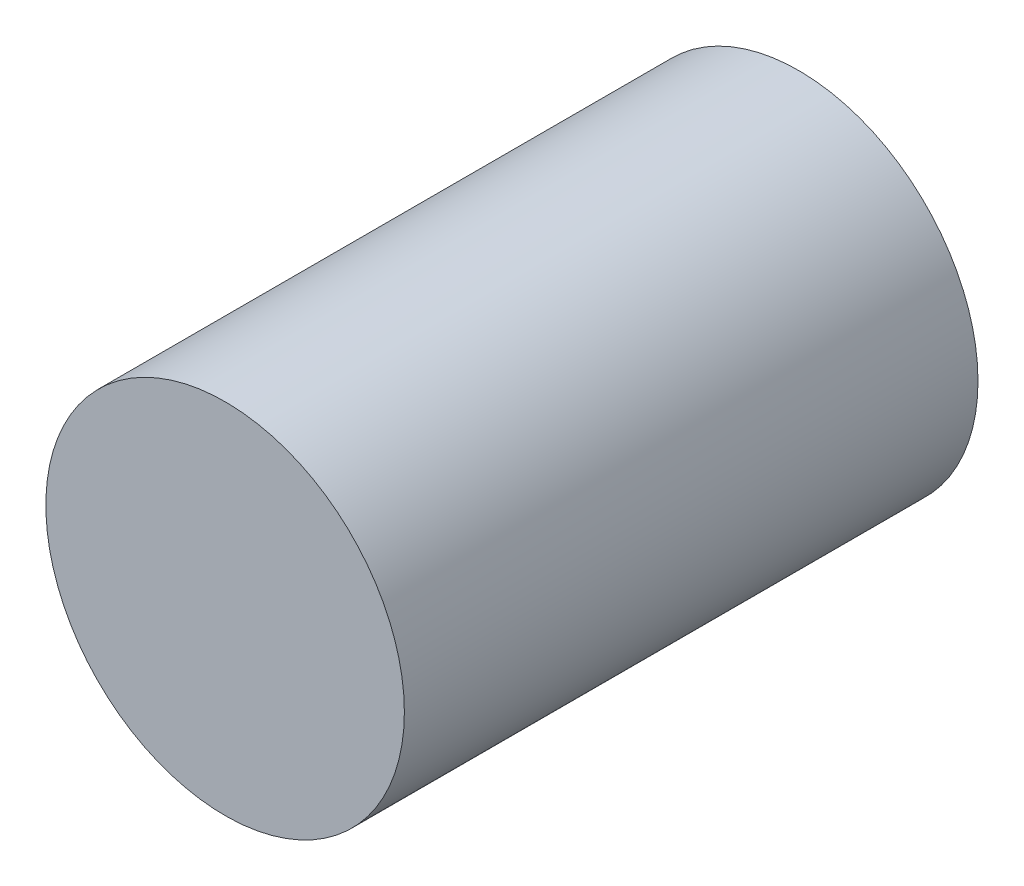
ISO-10303-21;
HEADER;
FILE_DESCRIPTION(('STEP AP214'),'2;1');
FILE_NAME('part.step','',(''),(''),'','','');
FILE_SCHEMA(('AUTOMOTIVE_DESIGN { 1 0 10303 214 1 1 1 1 }'));
ENDSEC;
DATA;
#1=APPLICATION_CONTEXT('core data for automotive mechanical design processes');
#2=APPLICATION_PROTOCOL_DEFINITION('international standard','automotive_design',2000,#1);
#3=PRODUCT_CONTEXT('',#1,'mechanical');
#4=PRODUCT('Part','Part','',(#3));
#5=PRODUCT_RELATED_PRODUCT_CATEGORY('part','',(#4));
#6=PRODUCT_DEFINITION_FORMATION('','',#4);
#7=PRODUCT_DEFINITION_CONTEXT('part definition',#1,'design');
#8=PRODUCT_DEFINITION('design','',#6,#7);
#9=PRODUCT_DEFINITION_SHAPE('','',#8);
#10=(LENGTH_UNIT() NAMED_UNIT(*) SI_UNIT(.MILLI.,.METRE.));
#11=(NAMED_UNIT(*) PLANE_ANGLE_UNIT() SI_UNIT($,.RADIAN.));
#12=(NAMED_UNIT(*) SI_UNIT($,.STERADIAN.) SOLID_ANGLE_UNIT());
#13=UNCERTAINTY_MEASURE_WITH_UNIT(LENGTH_MEASURE(1.E-05),#10,'distance_accuracy_value','');
#14=(GEOMETRIC_REPRESENTATION_CONTEXT(3) GLOBAL_UNCERTAINTY_ASSIGNED_CONTEXT((#13)) GLOBAL_UNIT_ASSIGNED_CONTEXT((#10,
#11,#12)) REPRESENTATION_CONTEXT('',''));
#15=CARTESIAN_POINT('',(0.,0.,0.));
#16=DIRECTION('',(0.,0.,1.));
#17=DIRECTION('',(1.,0.,0.));
#18=AXIS2_PLACEMENT_3D('',#15,#16,#17);
#19=CARTESIAN_POINT('',(0.,0.,8.));
#20=DIRECTION('',(0.,0.,-1.));
#21=DIRECTION('',(-1.,0.,0.));
#22=AXIS2_PLACEMENT_3D('',#19,#20,#21);
#23=CYLINDRICAL_SURFACE('',#22,2.5);
#24=CARTESIAN_POINT('',(0.,0.,8.));
#25=DIRECTION('',(0.,0.,1.));
#26=DIRECTION('',(1.,0.,0.));
#27=AXIS2_PLACEMENT_3D('',#24,#25,#26);
#28=CIRCLE('',#27,2.5);
#29=CARTESIAN_POINT('',(2.5,0.,8.));
#30=VERTEX_POINT('',#29);
#31=EDGE_CURVE('E10',#30,#30,#28,.T.);
#32=ORIENTED_EDGE('',*,*,#31,.F.);
#33=EDGE_LOOP('',(#32));
#34=FACE_BOUND('',#33,.T.);
#35=CARTESIAN_POINT('',(0.,0.,0.));
#36=DIRECTION('',(0.,0.,1.));
#37=DIRECTION('',(1.,0.,0.));
#38=AXIS2_PLACEMENT_3D('',#35,#36,#37);
#39=CIRCLE('',#38,2.5);
#40=CARTESIAN_POINT('',(2.5,0.,0.));
#41=VERTEX_POINT('',#40);
#42=EDGE_CURVE('E34',#41,#41,#39,.T.);
#43=ORIENTED_EDGE('',*,*,#42,.T.);
#44=EDGE_LOOP('',(#43));
#45=FACE_BOUND('',#44,.T.);
#46=ADVANCED_FACE('F31',(#34,#45),#23,.T.);
#47=CARTESIAN_POINT('',(0.,0.,8.));
#48=DIRECTION('',(0.,0.,1.));
#49=DIRECTION('',(1.,0.,0.));
#50=AXIS2_PLACEMENT_3D('',#47,#48,#49);
#51=PLANE('',#50);
#52=ORIENTED_EDGE('',*,*,#31,.T.);
#53=EDGE_LOOP('',(#52));
#54=FACE_BOUND('',#53,.T.);
#55=ADVANCED_FACE('F46',(#54),#51,.T.);
#56=CARTESIAN_POINT('',(0.,0.,0.));
#57=DIRECTION('',(0.,0.,1.));
#58=DIRECTION('',(1.,0.,0.));
#59=AXIS2_PLACEMENT_3D('',#56,#57,#58);
#60=PLANE('',#59);
#61=ORIENTED_EDGE('',*,*,#42,.F.);
#62=EDGE_LOOP('',(#61));
#63=FACE_BOUND('',#62,.T.);
#64=ADVANCED_FACE('F44',(#63),#60,.F.);
#65=CLOSED_SHELL('',(#46,#55,#64));
#66=MANIFOLD_SOLID_BREP('B2',#65);
#67=ADVANCED_BREP_SHAPE_REPRESENTATION('',(#18,#66),#14);
#68=SHAPE_DEFINITION_REPRESENTATION(#9,#67);
ENDSEC;
END-ISO-10303-21;
